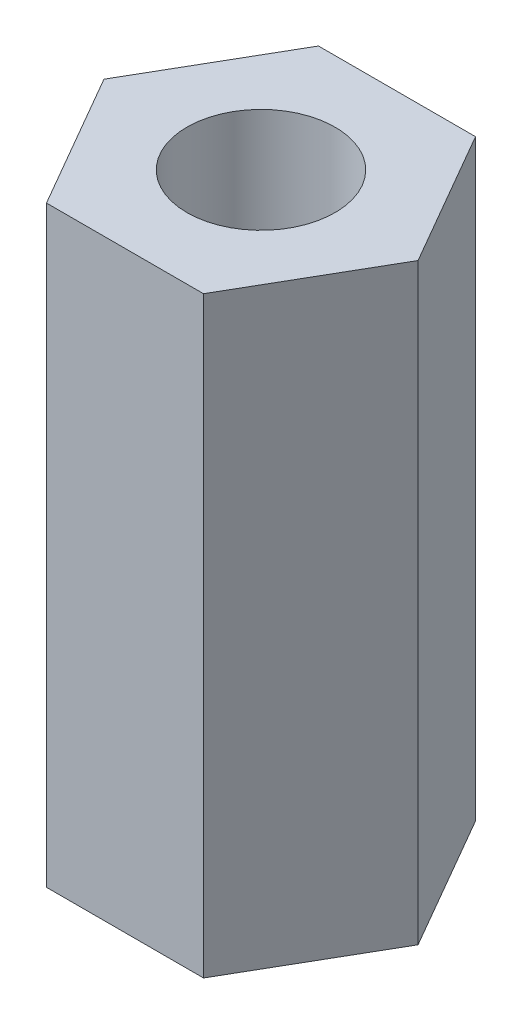
ISO-10303-21;
HEADER;
FILE_DESCRIPTION(('STEP AP214'),'2;1');
FILE_NAME('part.step','',(''),(''),'','','');
FILE_SCHEMA(('AUTOMOTIVE_DESIGN { 1 0 10303 214 1 1 1 1 }'));
ENDSEC;
DATA;
#1=APPLICATION_CONTEXT('core data for automotive mechanical design processes');
#2=APPLICATION_PROTOCOL_DEFINITION('international standard','automotive_design',2000,#1);
#3=PRODUCT_CONTEXT('',#1,'mechanical');
#4=PRODUCT('Part','Part','',(#3));
#5=PRODUCT_RELATED_PRODUCT_CATEGORY('part','',(#4));
#6=PRODUCT_DEFINITION_FORMATION('','',#4);
#7=PRODUCT_DEFINITION_CONTEXT('part definition',#1,'design');
#8=PRODUCT_DEFINITION('design','',#6,#7);
#9=PRODUCT_DEFINITION_SHAPE('','',#8);
#10=(LENGTH_UNIT() NAMED_UNIT(*) SI_UNIT(.MILLI.,.METRE.));
#11=(NAMED_UNIT(*) PLANE_ANGLE_UNIT() SI_UNIT($,.RADIAN.));
#12=(NAMED_UNIT(*) SI_UNIT($,.STERADIAN.) SOLID_ANGLE_UNIT());
#13=UNCERTAINTY_MEASURE_WITH_UNIT(LENGTH_MEASURE(1.E-05),#10,'distance_accuracy_value','');
#14=(GEOMETRIC_REPRESENTATION_CONTEXT(3) GLOBAL_UNCERTAINTY_ASSIGNED_CONTEXT((#13)) GLOBAL_UNIT_ASSIGNED_CONTEXT((#10,
#11,#12)) REPRESENTATION_CONTEXT('',''));
#15=CARTESIAN_POINT('',(0.,0.,0.));
#16=DIRECTION('',(0.,0.,1.));
#17=DIRECTION('',(1.,0.,0.));
#18=AXIS2_PLACEMENT_3D('',#15,#16,#17);
#19=CARTESIAN_POINT('',(1.32500000000003,10.,2.29496732002875));
#20=DIRECTION('',(-0.866025403784443,0.,-0.499999999999996));
#21=DIRECTION('',(-0.499999999999996,0.,0.866025403784443));
#22=AXIS2_PLACEMENT_3D('',#19,#20,#21);
#23=PLANE('',#22);
#24=DIRECTION('',(0.499999999999996,0.,-0.866025403784443));
#25=VECTOR('',#24,1.);
#26=CARTESIAN_POINT('',(1.32500000000003,0.,2.29496732002875));
#27=LINE('',#26,#25);
#28=CARTESIAN_POINT('',(1.32500000000003,0.,2.29496732002875));
#29=VERTEX_POINT('',#28);
#30=CARTESIAN_POINT('',(2.65000000000003,0.,0.));
#31=VERTEX_POINT('',#30);
#32=EDGE_CURVE('E134',#29,#31,#27,.T.);
#33=ORIENTED_EDGE('',*,*,#32,.T.);
#34=DIRECTION('',(0.,-1.,0.));
#35=VECTOR('',#34,1.);
#36=CARTESIAN_POINT('',(2.65000000000003,10.,0.));
#37=LINE('',#36,#35);
#38=CARTESIAN_POINT('',(2.65000000000003,10.,0.));
#39=VERTEX_POINT('',#38);
#40=EDGE_CURVE('E11',#39,#31,#37,.T.);
#41=ORIENTED_EDGE('',*,*,#40,.F.);
#42=DIRECTION('',(0.499999999999996,0.,-0.866025403784443));
#43=VECTOR('',#42,1.);
#44=CARTESIAN_POINT('',(1.32500000000003,10.,2.29496732002875));
#45=LINE('',#44,#43);
#46=CARTESIAN_POINT('',(1.32500000000003,10.,2.29496732002875));
#47=VERTEX_POINT('',#46);
#48=EDGE_CURVE('E151',#47,#39,#45,.T.);
#49=ORIENTED_EDGE('',*,*,#48,.F.);
#50=DIRECTION('',(0.,-1.,0.));
#51=VECTOR('',#50,1.);
#52=CARTESIAN_POINT('',(1.32500000000003,10.,2.29496732002875));
#53=LINE('',#52,#51);
#54=EDGE_CURVE('E130',#47,#29,#53,.T.);
#55=ORIENTED_EDGE('',*,*,#54,.T.);
#56=EDGE_LOOP('',(#33,#41,#49,#55));
#57=FACE_BOUND('',#56,.T.);
#58=ADVANCED_FACE('F44',(#57),#23,.F.);
#59=CARTESIAN_POINT('',(2.65000000000003,10.,0.));
#60=DIRECTION('',(-0.866025403784439,0.,0.500000000000002));
#61=DIRECTION('',(0.500000000000002,0.,0.866025403784439));
#62=AXIS2_PLACEMENT_3D('',#59,#60,#61);
#63=PLANE('',#62);
#64=DIRECTION('',(-0.500000000000002,0.,-0.866025403784439));
#65=VECTOR('',#64,1.);
#66=CARTESIAN_POINT('',(2.65000000000003,0.,0.));
#67=LINE('',#66,#65);
#68=CARTESIAN_POINT('',(1.32499999999999,0.,-2.29496732002877));
#69=VERTEX_POINT('',#68);
#70=EDGE_CURVE('E138',#31,#69,#67,.T.);
#71=ORIENTED_EDGE('',*,*,#70,.T.);
#72=DIRECTION('',(0.,-1.,0.));
#73=VECTOR('',#72,1.);
#74=CARTESIAN_POINT('',(1.32499999999999,10.,-2.29496732002877));
#75=LINE('',#74,#73);
#76=CARTESIAN_POINT('',(1.32499999999999,10.,-2.29496732002877));
#77=VERTEX_POINT('',#76);
#78=EDGE_CURVE('E53',#77,#69,#75,.T.);
#79=ORIENTED_EDGE('',*,*,#78,.F.);
#80=DIRECTION('',(-0.500000000000002,0.,-0.866025403784439));
#81=VECTOR('',#80,1.);
#82=CARTESIAN_POINT('',(2.65000000000003,10.,0.));
#83=LINE('',#82,#81);
#84=EDGE_CURVE('E98',#39,#77,#83,.T.);
#85=ORIENTED_EDGE('',*,*,#84,.F.);
#86=ORIENTED_EDGE('',*,*,#40,.T.);
#87=EDGE_LOOP('',(#71,#79,#85,#86));
#88=FACE_BOUND('',#87,.T.);
#89=ADVANCED_FACE('F181',(#88),#63,.F.);
#90=CARTESIAN_POINT('',(1.32499999999999,10.,-2.29496732002877));
#91=DIRECTION('',(0.,0.,1.));
#92=DIRECTION('',(1.,0.,0.));
#93=AXIS2_PLACEMENT_3D('',#90,#91,#92);
#94=PLANE('',#93);
#95=DIRECTION('',(-1.,0.,0.));
#96=VECTOR('',#95,1.);
#97=CARTESIAN_POINT('',(1.32499999999999,0.,-2.29496732002877));
#98=LINE('',#97,#96);
#99=CARTESIAN_POINT('',(-1.32499999999999,0.,-2.29496732002874));
#100=VERTEX_POINT('',#99);
#101=EDGE_CURVE('E142',#69,#100,#98,.T.);
#102=ORIENTED_EDGE('',*,*,#101,.T.);
#103=DIRECTION('',(0.,-1.,0.));
#104=VECTOR('',#103,1.);
#105=CARTESIAN_POINT('',(-1.32499999999999,10.,-2.29496732002874));
#106=LINE('',#105,#104);
#107=CARTESIAN_POINT('',(-1.32499999999999,10.,-2.29496732002874));
#108=VERTEX_POINT('',#107);
#109=EDGE_CURVE('E122',#108,#100,#106,.T.);
#110=ORIENTED_EDGE('',*,*,#109,.F.);
#111=DIRECTION('',(-1.,0.,0.));
#112=VECTOR('',#111,1.);
#113=CARTESIAN_POINT('',(1.32499999999999,10.,-2.29496732002877));
#114=LINE('',#113,#112);
#115=EDGE_CURVE('E111',#77,#108,#114,.T.);
#116=ORIENTED_EDGE('',*,*,#115,.F.);
#117=ORIENTED_EDGE('',*,*,#78,.T.);
#118=EDGE_LOOP('',(#102,#110,#116,#117));
#119=FACE_BOUND('',#118,.T.);
#120=ADVANCED_FACE('F162',(#119),#94,.F.);
#121=CARTESIAN_POINT('',(-1.32499999999999,10.,-2.29496732002874));
#122=DIRECTION('',(0.866025403784443,0.,0.499999999999996));
#123=DIRECTION('',(0.499999999999996,0.,-0.866025403784443));
#124=AXIS2_PLACEMENT_3D('',#121,#122,#123);
#125=PLANE('',#124);
#126=DIRECTION('',(-0.499999999999996,0.,0.866025403784443));
#127=VECTOR('',#126,1.);
#128=CARTESIAN_POINT('',(-1.32499999999999,0.,-2.29496732002874));
#129=LINE('',#128,#127);
#130=CARTESIAN_POINT('',(-2.64999999999998,0.,0.));
#131=VERTEX_POINT('',#130);
#132=EDGE_CURVE('E120',#100,#131,#129,.T.);
#133=ORIENTED_EDGE('',*,*,#132,.T.);
#134=DIRECTION('',(0.,-1.,0.));
#135=VECTOR('',#134,1.);
#136=CARTESIAN_POINT('',(-2.64999999999998,10.,0.));
#137=LINE('',#136,#135);
#138=CARTESIAN_POINT('',(-2.64999999999998,10.,0.));
#139=VERTEX_POINT('',#138);
#140=EDGE_CURVE('E117',#139,#131,#137,.T.);
#141=ORIENTED_EDGE('',*,*,#140,.F.);
#142=DIRECTION('',(-0.499999999999996,0.,0.866025403784443));
#143=VECTOR('',#142,1.);
#144=CARTESIAN_POINT('',(-1.32499999999999,10.,-2.29496732002874));
#145=LINE('',#144,#143);
#146=EDGE_CURVE('E105',#108,#139,#145,.T.);
#147=ORIENTED_EDGE('',*,*,#146,.F.);
#148=ORIENTED_EDGE('',*,*,#109,.T.);
#149=EDGE_LOOP('',(#133,#141,#147,#148));
#150=FACE_BOUND('',#149,.T.);
#151=ADVANCED_FACE('F118',(#150),#125,.F.);
#152=CARTESIAN_POINT('',(-2.64999999999998,10.,0.));
#153=DIRECTION('',(0.866025403784436,0.,-0.500000000000008));
#154=DIRECTION('',(-0.500000000000008,0.,-0.866025403784436));
#155=AXIS2_PLACEMENT_3D('',#152,#153,#154);
#156=PLANE('',#155);
#157=DIRECTION('',(0.500000000000008,0.,0.866025403784436));
#158=VECTOR('',#157,1.);
#159=CARTESIAN_POINT('',(-2.64999999999998,0.,0.));
#160=LINE('',#159,#158);
#161=CARTESIAN_POINT('',(-1.32499999999998,0.,2.29496732002877));
#162=VERTEX_POINT('',#161);
#163=EDGE_CURVE('E84',#131,#162,#160,.T.);
#164=ORIENTED_EDGE('',*,*,#163,.T.);
#165=DIRECTION('',(0.,-1.,0.));
#166=VECTOR('',#165,1.);
#167=CARTESIAN_POINT('',(-1.32499999999998,10.,2.29496732002877));
#168=LINE('',#167,#166);
#169=CARTESIAN_POINT('',(-1.32499999999998,10.,2.29496732002877));
#170=VERTEX_POINT('',#169);
#171=EDGE_CURVE('E123',#170,#162,#168,.T.);
#172=ORIENTED_EDGE('',*,*,#171,.F.);
#173=DIRECTION('',(0.500000000000008,0.,0.866025403784436));
#174=VECTOR('',#173,1.);
#175=CARTESIAN_POINT('',(-2.64999999999998,10.,0.));
#176=LINE('',#175,#174);
#177=EDGE_CURVE('E109',#139,#170,#176,.T.);
#178=ORIENTED_EDGE('',*,*,#177,.F.);
#179=ORIENTED_EDGE('',*,*,#140,.T.);
#180=EDGE_LOOP('',(#164,#172,#178,#179));
#181=FACE_BOUND('',#180,.T.);
#182=ADVANCED_FACE('F125',(#181),#156,.F.);
#183=CARTESIAN_POINT('',(-1.32499999999998,10.,2.29496732002877));
#184=DIRECTION('',(0.,0.,-1.));
#185=DIRECTION('',(-1.,0.,0.));
#186=AXIS2_PLACEMENT_3D('',#183,#184,#185);
#187=PLANE('',#186);
#188=DIRECTION('',(1.,0.,0.));
#189=VECTOR('',#188,1.);
#190=CARTESIAN_POINT('',(-1.32499999999998,0.,2.29496732002877));
#191=LINE('',#190,#189);
#192=EDGE_CURVE('E90',#162,#29,#191,.T.);
#193=ORIENTED_EDGE('',*,*,#192,.T.);
#194=ORIENTED_EDGE('',*,*,#54,.F.);
#195=DIRECTION('',(1.,0.,0.));
#196=VECTOR('',#195,1.);
#197=CARTESIAN_POINT('',(-1.32499999999998,10.,2.29496732002877));
#198=LINE('',#197,#196);
#199=EDGE_CURVE('E61',#170,#47,#198,.T.);
#200=ORIENTED_EDGE('',*,*,#199,.F.);
#201=ORIENTED_EDGE('',*,*,#171,.T.);
#202=EDGE_LOOP('',(#193,#194,#200,#201));
#203=FACE_BOUND('',#202,.T.);
#204=ADVANCED_FACE('F169',(#203),#187,.F.);
#205=CARTESIAN_POINT('',(0.,10.,0.));
#206=DIRECTION('',(0.,1.,0.));
#207=DIRECTION('',(0.,0.,1.));
#208=AXIS2_PLACEMENT_3D('',#205,#206,#207);
#209=PLANE('',#208);
#210=CARTESIAN_POINT('',(0.,10.,0.));
#211=DIRECTION('',(0.,1.,0.));
#212=DIRECTION('',(0.,0.,1.));
#213=AXIS2_PLACEMENT_3D('',#210,#211,#212);
#214=CIRCLE('',#213,1.25);
#215=CARTESIAN_POINT('',(0.,10.,1.25));
#216=VERTEX_POINT('',#215);
#217=EDGE_CURVE('E268',#216,#216,#214,.T.);
#218=ORIENTED_EDGE('',*,*,#217,.F.);
#219=EDGE_LOOP('',(#218));
#220=FACE_BOUND('',#219,.T.);
#221=ORIENTED_EDGE('',*,*,#48,.T.);
#222=ORIENTED_EDGE('',*,*,#84,.T.);
#223=ORIENTED_EDGE('',*,*,#115,.T.);
#224=ORIENTED_EDGE('',*,*,#146,.T.);
#225=ORIENTED_EDGE('',*,*,#177,.T.);
#226=ORIENTED_EDGE('',*,*,#199,.T.);
#227=EDGE_LOOP('',(#221,#222,#223,#224,#225,#226));
#228=FACE_BOUND('',#227,.T.);
#229=ADVANCED_FACE('F107',(#220,#228),#209,.T.);
#230=CARTESIAN_POINT('',(0.,0.,0.));
#231=DIRECTION('',(0.,1.,0.));
#232=DIRECTION('',(0.,0.,1.));
#233=AXIS2_PLACEMENT_3D('',#230,#231,#232);
#234=PLANE('',#233);
#235=CARTESIAN_POINT('',(0.,0.,0.));
#236=DIRECTION('',(0.,1.,0.));
#237=DIRECTION('',(0.,0.,1.));
#238=AXIS2_PLACEMENT_3D('',#235,#236,#237);
#239=CIRCLE('',#238,1.25);
#240=CARTESIAN_POINT('',(0.,0.,1.25));
#241=VERTEX_POINT('',#240);
#242=EDGE_CURVE('E139',#241,#241,#239,.T.);
#243=ORIENTED_EDGE('',*,*,#242,.T.);
#244=EDGE_LOOP('',(#243));
#245=FACE_BOUND('',#244,.T.);
#246=ORIENTED_EDGE('',*,*,#32,.F.);
#247=ORIENTED_EDGE('',*,*,#192,.F.);
#248=ORIENTED_EDGE('',*,*,#163,.F.);
#249=ORIENTED_EDGE('',*,*,#132,.F.);
#250=ORIENTED_EDGE('',*,*,#101,.F.);
#251=ORIENTED_EDGE('',*,*,#70,.F.);
#252=EDGE_LOOP('',(#246,#247,#248,#249,#250,#251));
#253=FACE_BOUND('',#252,.T.);
#254=ADVANCED_FACE('F165',(#245,#253),#234,.F.);
#255=CARTESIAN_POINT('',(0.,10.,0.));
#256=DIRECTION('',(0.,1.,0.));
#257=DIRECTION('',(0.,0.,1.));
#258=AXIS2_PLACEMENT_3D('',#255,#256,#257);
#259=CYLINDRICAL_SURFACE('',#258,1.25);
#260=ORIENTED_EDGE('',*,*,#242,.F.);
#261=EDGE_LOOP('',(#260));
#262=FACE_BOUND('',#261,.T.);
#263=ORIENTED_EDGE('',*,*,#217,.T.);
#264=EDGE_LOOP('',(#263));
#265=FACE_BOUND('',#264,.T.);
#266=ADVANCED_FACE('F218',(#262,#265),#259,.F.);
#267=CLOSED_SHELL('',(#58,#89,#120,#151,#182,#204,#229,#254,#266));
#268=MANIFOLD_SOLID_BREP('B2',#267);
#269=ADVANCED_BREP_SHAPE_REPRESENTATION('',(#18,#268),#14);
#270=SHAPE_DEFINITION_REPRESENTATION(#9,#269);
ENDSEC;
END-ISO-10303-21;
